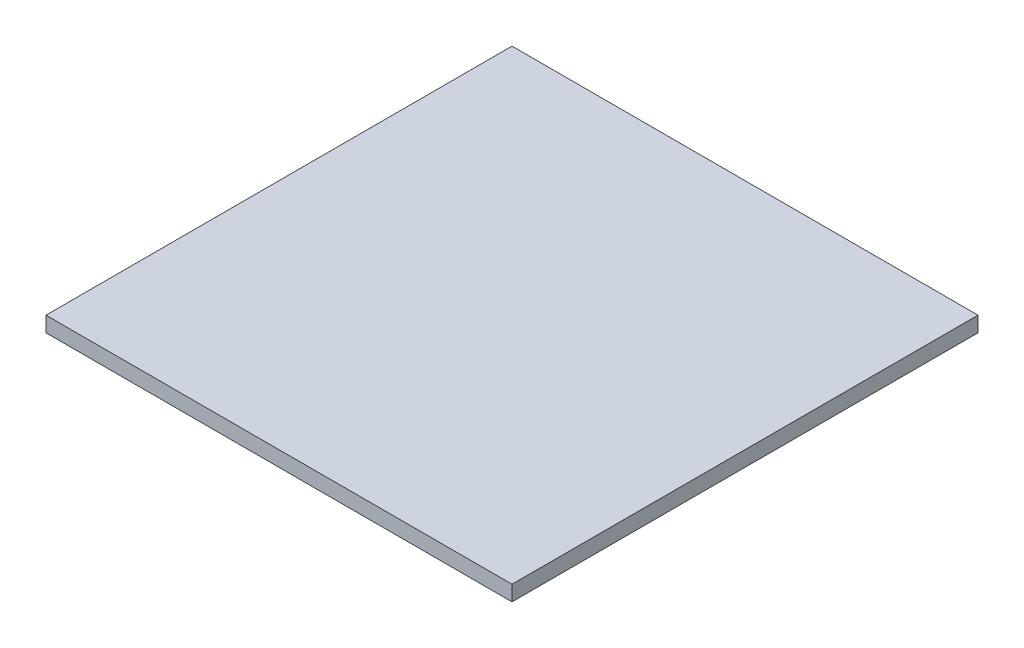
ISO-10303-21;
HEADER;
FILE_DESCRIPTION(('STEP AP214'),'2;1');
FILE_NAME('part.step','',(''),(''),'','','');
FILE_SCHEMA(('AUTOMOTIVE_DESIGN { 1 0 10303 214 1 1 1 1 }'));
ENDSEC;
DATA;
#1=APPLICATION_CONTEXT('core data for automotive mechanical design processes');
#2=APPLICATION_PROTOCOL_DEFINITION('international standard','automotive_design',2000,#1);
#3=PRODUCT_CONTEXT('',#1,'mechanical');
#4=PRODUCT('Part','Part','',(#3));
#5=PRODUCT_RELATED_PRODUCT_CATEGORY('part','',(#4));
#6=PRODUCT_DEFINITION_FORMATION('','',#4);
#7=PRODUCT_DEFINITION_CONTEXT('part definition',#1,'design');
#8=PRODUCT_DEFINITION('design','',#6,#7);
#9=PRODUCT_DEFINITION_SHAPE('','',#8);
#10=(LENGTH_UNIT() NAMED_UNIT(*) SI_UNIT(.MILLI.,.METRE.));
#11=(NAMED_UNIT(*) PLANE_ANGLE_UNIT() SI_UNIT($,.RADIAN.));
#12=(NAMED_UNIT(*) SI_UNIT($,.STERADIAN.) SOLID_ANGLE_UNIT());
#13=UNCERTAINTY_MEASURE_WITH_UNIT(LENGTH_MEASURE(1.E-05),#10,'distance_accuracy_value','');
#14=(GEOMETRIC_REPRESENTATION_CONTEXT(3) GLOBAL_UNCERTAINTY_ASSIGNED_CONTEXT((#13)) GLOBAL_UNIT_ASSIGNED_CONTEXT((#10,
#11,#12)) REPRESENTATION_CONTEXT('',''));
#15=CARTESIAN_POINT('',(0.,0.,0.));
#16=DIRECTION('',(0.,0.,1.));
#17=DIRECTION('',(1.,0.,0.));
#18=AXIS2_PLACEMENT_3D('',#15,#16,#17);
#19=CARTESIAN_POINT('',(-76.2,-2.50000000000001,152.4));
#20=DIRECTION('',(1.,0.,0.));
#21=DIRECTION('',(0.,0.,-1.));
#22=AXIS2_PLACEMENT_3D('',#19,#20,#21);
#23=PLANE('',#22);
#24=DIRECTION('',(0.,-1.,0.));
#25=VECTOR('',#24,1.);
#26=CARTESIAN_POINT('',(-76.2,-2.50000000000001,0.));
#27=LINE('',#26,#25);
#28=CARTESIAN_POINT('',(-76.2,2.49999999999999,0.));
#29=VERTEX_POINT('',#28);
#30=CARTESIAN_POINT('',(-76.2,-2.50000000000001,0.));
#31=VERTEX_POINT('',#30);
#32=EDGE_CURVE('E107',#29,#31,#27,.T.);
#33=ORIENTED_EDGE('',*,*,#32,.T.);
#34=DIRECTION('',(0.,0.,-1.));
#35=VECTOR('',#34,1.);
#36=CARTESIAN_POINT('',(-76.2,-2.50000000000001,152.4));
#37=LINE('',#36,#35);
#38=CARTESIAN_POINT('',(-76.2,-2.50000000000001,152.4));
#39=VERTEX_POINT('',#38);
#40=EDGE_CURVE('E11',#39,#31,#37,.T.);
#41=ORIENTED_EDGE('',*,*,#40,.F.);
#42=DIRECTION('',(0.,-1.,0.));
#43=VECTOR('',#42,1.);
#44=CARTESIAN_POINT('',(-76.2,-2.50000000000001,152.4));
#45=LINE('',#44,#43);
#46=CARTESIAN_POINT('',(-76.2,2.49999999999999,152.4));
#47=VERTEX_POINT('',#46);
#48=EDGE_CURVE('E91',#47,#39,#45,.T.);
#49=ORIENTED_EDGE('',*,*,#48,.F.);
#50=DIRECTION('',(0.,0.,-1.));
#51=VECTOR('',#50,1.);
#52=CARTESIAN_POINT('',(-76.2,2.49999999999999,152.4));
#53=LINE('',#52,#51);
#54=EDGE_CURVE('E103',#47,#29,#53,.T.);
#55=ORIENTED_EDGE('',*,*,#54,.T.);
#56=EDGE_LOOP('',(#33,#41,#49,#55));
#57=FACE_BOUND('',#56,.T.);
#58=ADVANCED_FACE('F39',(#57),#23,.F.);
#59=CARTESIAN_POINT('',(76.2,-2.49999999999999,152.4));
#60=DIRECTION('',(0.,1.,0.));
#61=DIRECTION('',(-1.,0.,0.));
#62=AXIS2_PLACEMENT_3D('',#59,#60,#61);
#63=PLANE('',#62);
#64=DIRECTION('',(1.,0.,0.));
#65=VECTOR('',#64,1.);
#66=CARTESIAN_POINT('',(76.2,-2.49999999999999,0.));
#67=LINE('',#66,#65);
#68=CARTESIAN_POINT('',(76.2,-2.49999999999999,0.));
#69=VERTEX_POINT('',#68);
#70=EDGE_CURVE('E96',#31,#69,#67,.T.);
#71=ORIENTED_EDGE('',*,*,#70,.T.);
#72=DIRECTION('',(0.,0.,-1.));
#73=VECTOR('',#72,1.);
#74=CARTESIAN_POINT('',(76.2,-2.49999999999999,152.4));
#75=LINE('',#74,#73);
#76=CARTESIAN_POINT('',(76.2,-2.49999999999999,152.4));
#77=VERTEX_POINT('',#76);
#78=EDGE_CURVE('E48',#77,#69,#75,.T.);
#79=ORIENTED_EDGE('',*,*,#78,.F.);
#80=DIRECTION('',(1.,0.,0.));
#81=VECTOR('',#80,1.);
#82=CARTESIAN_POINT('',(76.2,-2.49999999999999,152.4));
#83=LINE('',#82,#81);
#84=EDGE_CURVE('E86',#39,#77,#83,.T.);
#85=ORIENTED_EDGE('',*,*,#84,.F.);
#86=ORIENTED_EDGE('',*,*,#40,.T.);
#87=EDGE_LOOP('',(#71,#79,#85,#86));
#88=FACE_BOUND('',#87,.T.);
#89=ADVANCED_FACE('F95',(#88),#63,.F.);
#90=CARTESIAN_POINT('',(76.2,-2.49999999999999,152.4));
#91=DIRECTION('',(-1.,0.,0.));
#92=DIRECTION('',(0.,0.,1.));
#93=AXIS2_PLACEMENT_3D('',#90,#91,#92);
#94=PLANE('',#93);
#95=DIRECTION('',(0.,1.,0.));
#96=VECTOR('',#95,1.);
#97=CARTESIAN_POINT('',(76.2,-2.49999999999999,0.));
#98=LINE('',#97,#96);
#99=CARTESIAN_POINT('',(76.2,2.50000000000001,0.));
#100=VERTEX_POINT('',#99);
#101=EDGE_CURVE('E73',#69,#100,#98,.T.);
#102=ORIENTED_EDGE('',*,*,#101,.T.);
#103=DIRECTION('',(0.,0.,-1.));
#104=VECTOR('',#103,1.);
#105=CARTESIAN_POINT('',(76.2,2.50000000000001,152.4));
#106=LINE('',#105,#104);
#107=CARTESIAN_POINT('',(76.2,2.50000000000001,152.4));
#108=VERTEX_POINT('',#107);
#109=EDGE_CURVE('E98',#108,#100,#106,.T.);
#110=ORIENTED_EDGE('',*,*,#109,.F.);
#111=DIRECTION('',(0.,1.,0.));
#112=VECTOR('',#111,1.);
#113=CARTESIAN_POINT('',(76.2,-2.49999999999999,152.4));
#114=LINE('',#113,#112);
#115=EDGE_CURVE('E89',#77,#108,#114,.T.);
#116=ORIENTED_EDGE('',*,*,#115,.F.);
#117=ORIENTED_EDGE('',*,*,#78,.T.);
#118=EDGE_LOOP('',(#102,#110,#116,#117));
#119=FACE_BOUND('',#118,.T.);
#120=ADVANCED_FACE('F99',(#119),#94,.F.);
#121=CARTESIAN_POINT('',(76.2,2.50000000000001,152.4));
#122=DIRECTION('',(0.,-1.,0.));
#123=DIRECTION('',(1.,0.,0.));
#124=AXIS2_PLACEMENT_3D('',#121,#122,#123);
#125=PLANE('',#124);
#126=DIRECTION('',(-1.,0.,0.));
#127=VECTOR('',#126,1.);
#128=CARTESIAN_POINT('',(76.2,2.50000000000001,0.));
#129=LINE('',#128,#127);
#130=EDGE_CURVE('E79',#100,#29,#129,.T.);
#131=ORIENTED_EDGE('',*,*,#130,.T.);
#132=ORIENTED_EDGE('',*,*,#54,.F.);
#133=DIRECTION('',(-1.,0.,0.));
#134=VECTOR('',#133,1.);
#135=CARTESIAN_POINT('',(76.2,2.50000000000001,152.4));
#136=LINE('',#135,#134);
#137=EDGE_CURVE('E56',#108,#47,#136,.T.);
#138=ORIENTED_EDGE('',*,*,#137,.F.);
#139=ORIENTED_EDGE('',*,*,#109,.T.);
#140=EDGE_LOOP('',(#131,#132,#138,#139));
#141=FACE_BOUND('',#140,.T.);
#142=ADVANCED_FACE('F120',(#141),#125,.F.);
#143=CARTESIAN_POINT('',(0.,0.,152.4));
#144=DIRECTION('',(0.,0.,1.));
#145=DIRECTION('',(1.,0.,0.));
#146=AXIS2_PLACEMENT_3D('',#143,#144,#145);
#147=PLANE('',#146);
#148=ORIENTED_EDGE('',*,*,#48,.T.);
#149=ORIENTED_EDGE('',*,*,#84,.T.);
#150=ORIENTED_EDGE('',*,*,#115,.T.);
#151=ORIENTED_EDGE('',*,*,#137,.T.);
#152=EDGE_LOOP('',(#148,#149,#150,#151));
#153=FACE_BOUND('',#152,.T.);
#154=ADVANCED_FACE('F87',(#153),#147,.T.);
#155=CARTESIAN_POINT('',(0.,0.,0.));
#156=DIRECTION('',(0.,0.,1.));
#157=DIRECTION('',(1.,0.,0.));
#158=AXIS2_PLACEMENT_3D('',#155,#156,#157);
#159=PLANE('',#158);
#160=ORIENTED_EDGE('',*,*,#32,.F.);
#161=ORIENTED_EDGE('',*,*,#130,.F.);
#162=ORIENTED_EDGE('',*,*,#101,.F.);
#163=ORIENTED_EDGE('',*,*,#70,.F.);
#164=EDGE_LOOP('',(#160,#161,#162,#163));
#165=FACE_BOUND('',#164,.T.);
#166=ADVANCED_FACE('F123',(#165),#159,.F.);
#167=CLOSED_SHELL('',(#58,#89,#120,#142,#154,#166));
#168=MANIFOLD_SOLID_BREP('B2',#167);
#169=ADVANCED_BREP_SHAPE_REPRESENTATION('',(#18,#168),#14);
#170=SHAPE_DEFINITION_REPRESENTATION(#9,#169);
ENDSEC;
END-ISO-10303-21;
